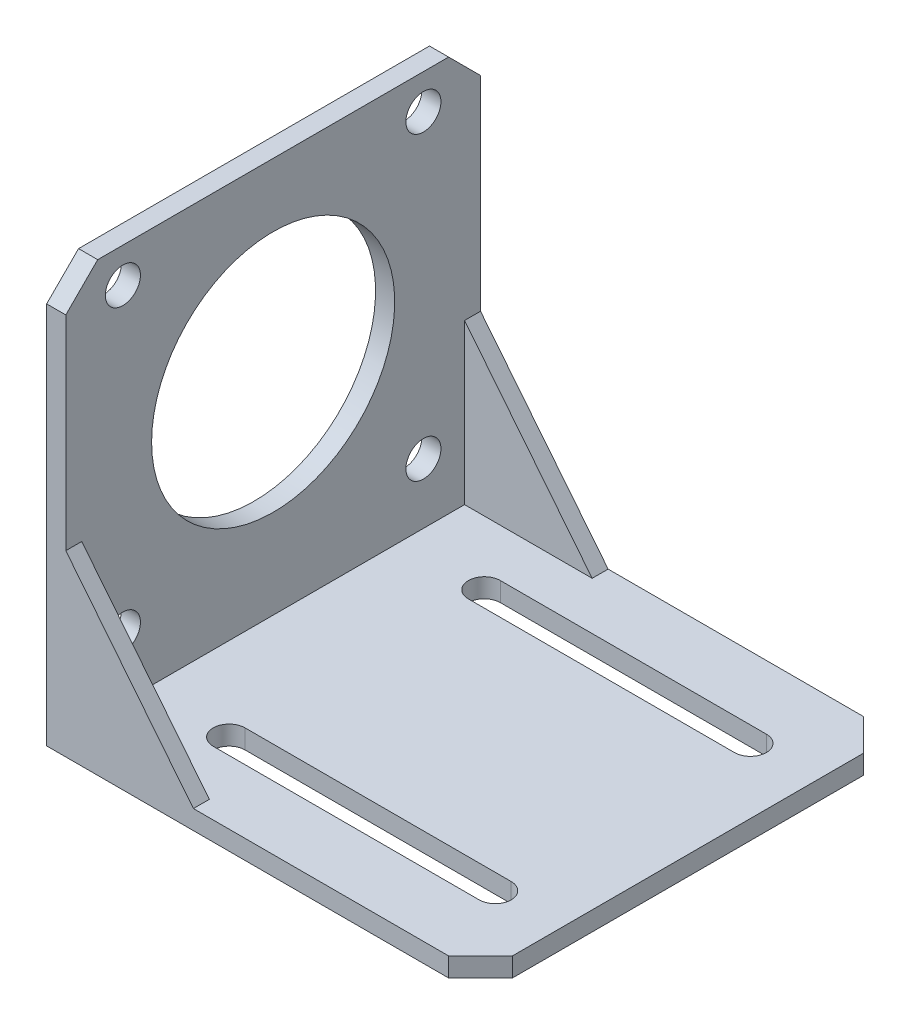
ISO-10303-21;
HEADER;
FILE_DESCRIPTION(('STEP AP214'),'2;1');
FILE_NAME('part.step','',(''),(''),'','','');
FILE_SCHEMA(('AUTOMOTIVE_DESIGN { 1 0 10303 214 1 1 1 1 }'));
ENDSEC;
DATA;
#1=APPLICATION_CONTEXT('core data for automotive mechanical design processes');
#2=APPLICATION_PROTOCOL_DEFINITION('international standard','automotive_design',2000,#1);
#3=PRODUCT_CONTEXT('',#1,'mechanical');
#4=PRODUCT('Part','Part','',(#3));
#5=PRODUCT_RELATED_PRODUCT_CATEGORY('part','',(#4));
#6=PRODUCT_DEFINITION_FORMATION('','',#4);
#7=PRODUCT_DEFINITION_CONTEXT('part definition',#1,'design');
#8=PRODUCT_DEFINITION('design','',#6,#7);
#9=PRODUCT_DEFINITION_SHAPE('','',#8);
#10=(LENGTH_UNIT() NAMED_UNIT(*) SI_UNIT(.MILLI.,.METRE.));
#11=(NAMED_UNIT(*) PLANE_ANGLE_UNIT() SI_UNIT($,.RADIAN.));
#12=(NAMED_UNIT(*) SI_UNIT($,.STERADIAN.) SOLID_ANGLE_UNIT());
#13=UNCERTAINTY_MEASURE_WITH_UNIT(LENGTH_MEASURE(1.E-05),#10,'distance_accuracy_value','');
#14=(GEOMETRIC_REPRESENTATION_CONTEXT(3) GLOBAL_UNCERTAINTY_ASSIGNED_CONTEXT((#13)) GLOBAL_UNIT_ASSIGNED_CONTEXT((#10,
#11,#12)) REPRESENTATION_CONTEXT('',''));
#15=CARTESIAN_POINT('',(0.,0.,0.));
#16=DIRECTION('',(0.,0.,1.));
#17=DIRECTION('',(1.,0.,0.));
#18=AXIS2_PLACEMENT_3D('',#15,#16,#17);
#19=CARTESIAN_POINT('',(34.,3.,-32.5));
#20=DIRECTION('',(-1.,0.,0.));
#21=DIRECTION('',(0.,0.,1.));
#22=AXIS2_PLACEMENT_3D('',#19,#20,#21);
#23=PLANE('',#22);
#24=DIRECTION('',(0.,0.,-1.));
#25=VECTOR('',#24,1.);
#26=CARTESIAN_POINT('',(34.,3.,-32.5));
#27=LINE('',#26,#25);
#28=CARTESIAN_POINT('',(34.,3.,27.5));
#29=VERTEX_POINT('',#28);
#30=CARTESIAN_POINT('',(34.,3.,-27.5));
#31=VERTEX_POINT('',#30);
#32=EDGE_CURVE('E217',#29,#31,#27,.T.);
#33=ORIENTED_EDGE('',*,*,#32,.F.);
#34=DIRECTION('',(0.,-1.,0.));
#35=VECTOR('',#34,1.);
#36=CARTESIAN_POINT('',(34.,3.,27.5));
#37=LINE('',#36,#35);
#38=CARTESIAN_POINT('',(34.,0.,27.5));
#39=VERTEX_POINT('',#38);
#40=EDGE_CURVE('E241',#29,#39,#37,.T.);
#41=ORIENTED_EDGE('',*,*,#40,.T.);
#42=DIRECTION('',(0.,0.,-1.));
#43=VECTOR('',#42,1.);
#44=CARTESIAN_POINT('',(34.,0.,-32.5));
#45=LINE('',#44,#43);
#46=CARTESIAN_POINT('',(34.,0.,-27.5));
#47=VERTEX_POINT('',#46);
#48=EDGE_CURVE('E297',#39,#47,#45,.T.);
#49=ORIENTED_EDGE('',*,*,#48,.T.);
#50=DIRECTION('',(0.,1.,0.));
#51=VECTOR('',#50,1.);
#52=CARTESIAN_POINT('',(34.,3.,-27.5));
#53=LINE('',#52,#51);
#54=EDGE_CURVE('E244',#47,#31,#53,.T.);
#55=ORIENTED_EDGE('',*,*,#54,.T.);
#56=EDGE_LOOP('',(#33,#41,#49,#55));
#57=FACE_BOUND('',#56,.T.);
#58=ADVANCED_FACE('F33',(#57),#23,.F.);
#59=CARTESIAN_POINT('',(-34.,3.,-32.5));
#60=DIRECTION('',(0.,0.,1.));
#61=DIRECTION('',(1.,0.,0.));
#62=AXIS2_PLACEMENT_3D('',#59,#60,#61);
#63=PLANE('',#62);
#64=DIRECTION('',(-1.,0.,0.));
#65=VECTOR('',#64,1.);
#66=CARTESIAN_POINT('',(-34.,3.,-32.5));
#67=LINE('',#66,#65);
#68=CARTESIAN_POINT('',(29.,3.,-32.5));
#69=VERTEX_POINT('',#68);
#70=CARTESIAN_POINT('',(-11.,3.,-32.5));
#71=VERTEX_POINT('',#70);
#72=EDGE_CURVE('E220',#69,#71,#67,.T.);
#73=ORIENTED_EDGE('',*,*,#72,.F.);
#74=DIRECTION('',(0.,-1.,0.));
#75=VECTOR('',#74,1.);
#76=CARTESIAN_POINT('',(29.,3.,-32.5));
#77=LINE('',#76,#75);
#78=CARTESIAN_POINT('',(29.,0.,-32.5));
#79=VERTEX_POINT('',#78);
#80=EDGE_CURVE('E11',#69,#79,#77,.T.);
#81=ORIENTED_EDGE('',*,*,#80,.T.);
#82=DIRECTION('',(-1.,0.,0.));
#83=VECTOR('',#82,1.);
#84=CARTESIAN_POINT('',(-34.,0.,-32.5));
#85=LINE('',#84,#83);
#86=CARTESIAN_POINT('',(-34.,0.,-32.5));
#87=VERTEX_POINT('',#86);
#88=EDGE_CURVE('E266',#79,#87,#85,.T.);
#89=ORIENTED_EDGE('',*,*,#88,.T.);
#90=DIRECTION('',(0.,-1.,0.));
#91=VECTOR('',#90,1.);
#92=CARTESIAN_POINT('',(-34.,3.,-32.5));
#93=LINE('',#92,#91);
#94=CARTESIAN_POINT('',(-34.,60.,-32.5));
#95=VERTEX_POINT('',#94);
#96=EDGE_CURVE('E271',#95,#87,#93,.T.);
#97=ORIENTED_EDGE('',*,*,#96,.F.);
#98=DIRECTION('',(1.,0.,0.));
#99=VECTOR('',#98,1.);
#100=CARTESIAN_POINT('',(-31.,60.,-32.5));
#101=LINE('',#100,#99);
#102=CARTESIAN_POINT('',(-31.,60.,-32.5));
#103=VERTEX_POINT('',#102);
#104=EDGE_CURVE('E287',#95,#103,#101,.T.);
#105=ORIENTED_EDGE('',*,*,#104,.T.);
#106=DIRECTION('',(0.,-1.,0.));
#107=VECTOR('',#106,1.);
#108=CARTESIAN_POINT('',(-31.,65.,-32.5));
#109=LINE('',#108,#107);
#110=CARTESIAN_POINT('',(-31.,28.,-32.5));
#111=VERTEX_POINT('',#110);
#112=EDGE_CURVE('E280',#103,#111,#109,.T.);
#113=ORIENTED_EDGE('',*,*,#112,.T.);
#114=DIRECTION('',(0.624695047554424,-0.78086880944303,0.));
#115=VECTOR('',#114,1.);
#116=CARTESIAN_POINT('',(-31.,28.,-32.5));
#117=LINE('',#116,#115);
#118=EDGE_CURVE('E200',#111,#71,#117,.T.);
#119=ORIENTED_EDGE('',*,*,#118,.T.);
#120=EDGE_LOOP('',(#73,#81,#89,#97,#105,#113,#119));
#121=FACE_BOUND('',#120,.T.);
#122=ADVANCED_FACE('F437',(#121),#63,.F.);
#123=CARTESIAN_POINT('',(-34.,3.,-32.5));
#124=DIRECTION('',(1.,0.,0.));
#125=DIRECTION('',(0.,0.,-1.));
#126=AXIS2_PLACEMENT_3D('',#123,#124,#125);
#127=PLANE('',#126);
#128=CARTESIAN_POINT('',(-34.,59.55,23.55));
#129=DIRECTION('',(-1.,0.,0.));
#130=DIRECTION('',(0.,0.,1.));
#131=AXIS2_PLACEMENT_3D('',#128,#129,#130);
#132=CIRCLE('',#131,2.75);
#133=CARTESIAN_POINT('',(-34.,59.55,26.3));
#134=VERTEX_POINT('',#133);
#135=EDGE_CURVE('E327',#134,#134,#132,.T.);
#136=ORIENTED_EDGE('',*,*,#135,.F.);
#137=EDGE_LOOP('',(#136));
#138=FACE_BOUND('',#137,.T.);
#139=CARTESIAN_POINT('',(-34.,59.55,-23.55));
#140=DIRECTION('',(-1.,0.,0.));
#141=DIRECTION('',(0.,0.,1.));
#142=AXIS2_PLACEMENT_3D('',#139,#140,#141);
#143=CIRCLE('',#142,2.75);
#144=CARTESIAN_POINT('',(-34.,59.55,-20.8));
#145=VERTEX_POINT('',#144);
#146=EDGE_CURVE('E332',#145,#145,#143,.T.);
#147=ORIENTED_EDGE('',*,*,#146,.F.);
#148=EDGE_LOOP('',(#147));
#149=FACE_BOUND('',#148,.T.);
#150=CARTESIAN_POINT('',(-34.,12.45,-23.55));
#151=DIRECTION('',(-1.,0.,0.));
#152=DIRECTION('',(0.,0.,1.));
#153=AXIS2_PLACEMENT_3D('',#150,#151,#152);
#154=CIRCLE('',#153,2.75);
#155=CARTESIAN_POINT('',(-34.,12.45,-20.8));
#156=VERTEX_POINT('',#155);
#157=EDGE_CURVE('E336',#156,#156,#154,.T.);
#158=ORIENTED_EDGE('',*,*,#157,.F.);
#159=EDGE_LOOP('',(#158));
#160=FACE_BOUND('',#159,.T.);
#161=CARTESIAN_POINT('',(-34.,12.45,23.55));
#162=DIRECTION('',(-1.,0.,0.));
#163=DIRECTION('',(0.,0.,1.));
#164=AXIS2_PLACEMENT_3D('',#161,#162,#163);
#165=CIRCLE('',#164,2.75);
#166=CARTESIAN_POINT('',(-34.,12.45,26.3));
#167=VERTEX_POINT('',#166);
#168=EDGE_CURVE('E340',#167,#167,#165,.T.);
#169=ORIENTED_EDGE('',*,*,#168,.F.);
#170=EDGE_LOOP('',(#169));
#171=FACE_BOUND('',#170,.T.);
#172=CARTESIAN_POINT('',(-34.,36.,0.));
#173=DIRECTION('',(-1.,0.,0.));
#174=DIRECTION('',(0.,0.,1.));
#175=AXIS2_PLACEMENT_3D('',#172,#173,#174);
#176=CIRCLE('',#175,19.05);
#177=CARTESIAN_POINT('',(-34.,36.,19.05));
#178=VERTEX_POINT('',#177);
#179=EDGE_CURVE('E344',#178,#178,#176,.T.);
#180=ORIENTED_EDGE('',*,*,#179,.F.);
#181=EDGE_LOOP('',(#180));
#182=FACE_BOUND('',#181,.T.);
#183=DIRECTION('',(0.,-1.,0.));
#184=VECTOR('',#183,1.);
#185=CARTESIAN_POINT('',(-34.,3.,32.5));
#186=LINE('',#185,#184);
#187=CARTESIAN_POINT('',(-34.,60.,32.5));
#188=VERTEX_POINT('',#187);
#189=CARTESIAN_POINT('',(-34.,0.,32.5));
#190=VERTEX_POINT('',#189);
#191=EDGE_CURVE('E261',#188,#190,#186,.T.);
#192=ORIENTED_EDGE('',*,*,#191,.F.);
#193=DIRECTION('',(0.,0.707106781186549,-0.707106781186546));
#194=VECTOR('',#193,1.);
#195=CARTESIAN_POINT('',(-34.,65.,27.5));
#196=LINE('',#195,#194);
#197=CARTESIAN_POINT('',(-34.,65.,27.5));
#198=VERTEX_POINT('',#197);
#199=EDGE_CURVE('E250',#188,#198,#196,.T.);
#200=ORIENTED_EDGE('',*,*,#199,.T.);
#201=DIRECTION('',(0.,0.,1.));
#202=VECTOR('',#201,1.);
#203=CARTESIAN_POINT('',(-34.,65.,-32.5));
#204=LINE('',#203,#202);
#205=CARTESIAN_POINT('',(-34.,65.,-27.5));
#206=VERTEX_POINT('',#205);
#207=EDGE_CURVE('E205',#206,#198,#204,.T.);
#208=ORIENTED_EDGE('',*,*,#207,.F.);
#209=DIRECTION('',(0.,-0.707106781186549,-0.707106781186546));
#210=VECTOR('',#209,1.);
#211=CARTESIAN_POINT('',(-34.,65.,-27.5));
#212=LINE('',#211,#210);
#213=EDGE_CURVE('E285',#206,#95,#212,.T.);
#214=ORIENTED_EDGE('',*,*,#213,.T.);
#215=ORIENTED_EDGE('',*,*,#96,.T.);
#216=DIRECTION('',(0.,0.,1.));
#217=VECTOR('',#216,1.);
#218=CARTESIAN_POINT('',(-34.,0.,-32.5));
#219=LINE('',#218,#217);
#220=EDGE_CURVE('E264',#87,#190,#219,.T.);
#221=ORIENTED_EDGE('',*,*,#220,.T.);
#222=EDGE_LOOP('',(#192,#200,#208,#214,#215,#221));
#223=FACE_BOUND('',#222,.T.);
#224=ADVANCED_FACE('F303',(#138,#149,#160,#171,#182,#223),#127,.F.);
#225=CARTESIAN_POINT('',(-34.,3.,32.5));
#226=DIRECTION('',(0.,0.,-1.));
#227=DIRECTION('',(-1.,0.,0.));
#228=AXIS2_PLACEMENT_3D('',#225,#226,#227);
#229=PLANE('',#228);
#230=DIRECTION('',(1.,0.,0.));
#231=VECTOR('',#230,1.);
#232=CARTESIAN_POINT('',(-34.,3.,32.5));
#233=LINE('',#232,#231);
#234=CARTESIAN_POINT('',(-11.,3.,32.5));
#235=VERTEX_POINT('',#234);
#236=CARTESIAN_POINT('',(29.,3.,32.5));
#237=VERTEX_POINT('',#236);
#238=EDGE_CURVE('E37',#235,#237,#233,.T.);
#239=ORIENTED_EDGE('',*,*,#238,.F.);
#240=DIRECTION('',(-0.624695047554424,0.78086880944303,0.));
#241=VECTOR('',#240,1.);
#242=CARTESIAN_POINT('',(-31.,28.,32.5));
#243=LINE('',#242,#241);
#244=CARTESIAN_POINT('',(-31.,28.,32.5));
#245=VERTEX_POINT('',#244);
#246=EDGE_CURVE('E315',#235,#245,#243,.T.);
#247=ORIENTED_EDGE('',*,*,#246,.T.);
#248=DIRECTION('',(0.,-1.,0.));
#249=VECTOR('',#248,1.);
#250=CARTESIAN_POINT('',(-31.,65.,32.5));
#251=LINE('',#250,#249);
#252=CARTESIAN_POINT('',(-31.,60.,32.5));
#253=VERTEX_POINT('',#252);
#254=EDGE_CURVE('E284',#253,#245,#251,.T.);
#255=ORIENTED_EDGE('',*,*,#254,.F.);
#256=DIRECTION('',(-1.,0.,0.));
#257=VECTOR('',#256,1.);
#258=CARTESIAN_POINT('',(-34.,60.,32.5));
#259=LINE('',#258,#257);
#260=EDGE_CURVE('E299',#253,#188,#259,.T.);
#261=ORIENTED_EDGE('',*,*,#260,.T.);
#262=ORIENTED_EDGE('',*,*,#191,.T.);
#263=DIRECTION('',(1.,0.,0.));
#264=VECTOR('',#263,1.);
#265=CARTESIAN_POINT('',(-34.,0.,32.5));
#266=LINE('',#265,#264);
#267=CARTESIAN_POINT('',(29.,0.,32.5));
#268=VERTEX_POINT('',#267);
#269=EDGE_CURVE('E221',#190,#268,#266,.T.);
#270=ORIENTED_EDGE('',*,*,#269,.T.);
#271=DIRECTION('',(0.,1.,0.));
#272=VECTOR('',#271,1.);
#273=CARTESIAN_POINT('',(29.,3.,32.5));
#274=LINE('',#273,#272);
#275=EDGE_CURVE('E228',#268,#237,#274,.T.);
#276=ORIENTED_EDGE('',*,*,#275,.T.);
#277=EDGE_LOOP('',(#239,#247,#255,#261,#262,#270,#276));
#278=FACE_BOUND('',#277,.T.);
#279=ADVANCED_FACE('F257',(#278),#229,.F.);
#280=CARTESIAN_POINT('',(0.,3.,0.));
#281=DIRECTION('',(0.,1.,0.));
#282=DIRECTION('',(0.,0.,1.));
#283=AXIS2_PLACEMENT_3D('',#280,#281,#282);
#284=PLANE('',#283);
#285=DIRECTION('',(0.,0.,-1.));
#286=VECTOR('',#285,1.);
#287=CARTESIAN_POINT('',(-11.,3.,-30.));
#288=LINE('',#287,#286);
#289=CARTESIAN_POINT('',(-11.,3.,-30.));
#290=VERTEX_POINT('',#289);
#291=EDGE_CURVE('E199',#290,#71,#288,.T.);
#292=ORIENTED_EDGE('',*,*,#291,.F.);
#293=DIRECTION('',(-1.,0.,0.));
#294=VECTOR('',#293,1.);
#295=CARTESIAN_POINT('',(-11.,3.,-30.));
#296=LINE('',#295,#294);
#297=CARTESIAN_POINT('',(-31.,3.,-30.));
#298=VERTEX_POINT('',#297);
#299=EDGE_CURVE('E187',#290,#298,#296,.T.);
#300=ORIENTED_EDGE('',*,*,#299,.T.);
#301=DIRECTION('',(0.,0.,-1.));
#302=VECTOR('',#301,1.);
#303=CARTESIAN_POINT('',(-31.,3.,-32.5));
#304=LINE('',#303,#302);
#305=CARTESIAN_POINT('',(-31.,3.,30.));
#306=VERTEX_POINT('',#305);
#307=EDGE_CURVE('E197',#306,#298,#304,.T.);
#308=ORIENTED_EDGE('',*,*,#307,.F.);
#309=DIRECTION('',(1.,0.,0.));
#310=VECTOR('',#309,1.);
#311=CARTESIAN_POINT('',(-11.,3.,30.));
#312=LINE('',#311,#310);
#313=CARTESIAN_POINT('',(-11.,3.,30.));
#314=VERTEX_POINT('',#313);
#315=EDGE_CURVE('E51',#306,#314,#312,.T.);
#316=ORIENTED_EDGE('',*,*,#315,.T.);
#317=DIRECTION('',(0.,0.,1.));
#318=VECTOR('',#317,1.);
#319=CARTESIAN_POINT('',(-11.,3.,30.));
#320=LINE('',#319,#318);
#321=EDGE_CURVE('E55',#314,#235,#320,.T.);
#322=ORIENTED_EDGE('',*,*,#321,.T.);
#323=ORIENTED_EDGE('',*,*,#238,.T.);
#324=DIRECTION('',(-0.707106781186549,0.,0.707106781186547));
#325=VECTOR('',#324,1.);
#326=CARTESIAN_POINT('',(30.75,3.,30.7500000000001));
#327=LINE('',#326,#325);
#328=EDGE_CURVE('E43',#237,#29,#327,.F.);
#329=ORIENTED_EDGE('',*,*,#328,.T.);
#330=ORIENTED_EDGE('',*,*,#32,.T.);
#331=DIRECTION('',(0.707106781186547,0.,0.707106781186549));
#332=VECTOR('',#331,1.);
#333=CARTESIAN_POINT('',(30.75,3.,-30.7499999999999));
#334=LINE('',#333,#332);
#335=EDGE_CURVE('E230',#31,#69,#334,.F.);
#336=ORIENTED_EDGE('',*,*,#335,.T.);
#337=ORIENTED_EDGE('',*,*,#72,.T.);
#338=EDGE_LOOP('',(#292,#300,#308,#316,#322,#323,#329,#330,#336,#337));
#339=FACE_BOUND('',#338,.T.);
#340=CARTESIAN_POINT('',(-17.9,3.,20.));
#341=DIRECTION('',(0.,1.,0.));
#342=DIRECTION('',(0.,0.,1.));
#343=AXIS2_PLACEMENT_3D('',#340,#341,#342);
#344=CIRCLE('',#343,2.5);
#345=CARTESIAN_POINT('',(-17.9,3.,17.5));
#346=VERTEX_POINT('',#345);
#347=CARTESIAN_POINT('',(-17.9,3.,22.5));
#348=VERTEX_POINT('',#347);
#349=EDGE_CURVE('E362',#346,#348,#344,.T.);
#350=ORIENTED_EDGE('',*,*,#349,.F.);
#351=DIRECTION('',(-1.,0.,0.));
#352=VECTOR('',#351,1.);
#353=CARTESIAN_POINT('',(-17.9,3.,17.5));
#354=LINE('',#353,#352);
#355=CARTESIAN_POINT('',(23.8,3.,17.5));
#356=VERTEX_POINT('',#355);
#357=EDGE_CURVE('E352',#356,#346,#354,.T.);
#358=ORIENTED_EDGE('',*,*,#357,.F.);
#359=CARTESIAN_POINT('',(23.8,3.,20.));
#360=DIRECTION('',(0.,1.,0.));
#361=DIRECTION('',(0.,0.,-1.));
#362=AXIS2_PLACEMENT_3D('',#359,#360,#361);
#363=CIRCLE('',#362,2.5);
#364=CARTESIAN_POINT('',(23.8,3.,22.5));
#365=VERTEX_POINT('',#364);
#366=EDGE_CURVE('E367',#365,#356,#363,.T.);
#367=ORIENTED_EDGE('',*,*,#366,.F.);
#368=DIRECTION('',(1.,0.,0.));
#369=VECTOR('',#368,1.);
#370=CARTESIAN_POINT('',(-17.9,3.,22.5));
#371=LINE('',#370,#369);
#372=EDGE_CURVE('E364',#348,#365,#371,.T.);
#373=ORIENTED_EDGE('',*,*,#372,.F.);
#374=EDGE_LOOP('',(#350,#358,#367,#373));
#375=FACE_BOUND('',#374,.T.);
#376=CARTESIAN_POINT('',(-17.9,3.,-20.));
#377=DIRECTION('',(0.,1.,0.));
#378=DIRECTION('',(0.,0.,1.));
#379=AXIS2_PLACEMENT_3D('',#376,#377,#378);
#380=CIRCLE('',#379,2.5);
#381=CARTESIAN_POINT('',(-17.9,3.,-22.5));
#382=VERTEX_POINT('',#381);
#383=CARTESIAN_POINT('',(-17.9,3.,-17.5));
#384=VERTEX_POINT('',#383);
#385=EDGE_CURVE('E374',#382,#384,#380,.T.);
#386=ORIENTED_EDGE('',*,*,#385,.F.);
#387=DIRECTION('',(-1.,0.,0.));
#388=VECTOR('',#387,1.);
#389=CARTESIAN_POINT('',(-17.9,3.,-22.5));
#390=LINE('',#389,#388);
#391=CARTESIAN_POINT('',(23.8,3.,-22.5));
#392=VERTEX_POINT('',#391);
#393=EDGE_CURVE('E385',#392,#382,#390,.T.);
#394=ORIENTED_EDGE('',*,*,#393,.F.);
#395=CARTESIAN_POINT('',(23.8,3.,-20.));
#396=DIRECTION('',(0.,1.,0.));
#397=DIRECTION('',(0.,0.,-1.));
#398=AXIS2_PLACEMENT_3D('',#395,#396,#397);
#399=CIRCLE('',#398,2.5);
#400=CARTESIAN_POINT('',(23.8,3.,-17.5));
#401=VERTEX_POINT('',#400);
#402=EDGE_CURVE('E399',#401,#392,#399,.T.);
#403=ORIENTED_EDGE('',*,*,#402,.F.);
#404=DIRECTION('',(1.,0.,0.));
#405=VECTOR('',#404,1.);
#406=CARTESIAN_POINT('',(-17.9,3.,-17.5));
#407=LINE('',#406,#405);
#408=EDGE_CURVE('E396',#384,#401,#407,.T.);
#409=ORIENTED_EDGE('',*,*,#408,.F.);
#410=EDGE_LOOP('',(#386,#394,#403,#409));
#411=FACE_BOUND('',#410,.T.);
#412=ADVANCED_FACE('F195',(#339,#375,#411),#284,.T.);
#413=CARTESIAN_POINT('',(0.,0.,0.));
#414=DIRECTION('',(0.,1.,0.));
#415=DIRECTION('',(0.,0.,1.));
#416=AXIS2_PLACEMENT_3D('',#413,#414,#415);
#417=PLANE('',#416);
#418=DIRECTION('',(-1.,0.,0.));
#419=VECTOR('',#418,1.);
#420=CARTESIAN_POINT('',(-17.9,0.,17.5));
#421=LINE('',#420,#419);
#422=CARTESIAN_POINT('',(23.8,0.,17.5));
#423=VERTEX_POINT('',#422);
#424=CARTESIAN_POINT('',(-17.9,0.,17.5));
#425=VERTEX_POINT('',#424);
#426=EDGE_CURVE('E358',#423,#425,#421,.T.);
#427=ORIENTED_EDGE('',*,*,#426,.T.);
#428=CARTESIAN_POINT('',(-17.9,0.,20.));
#429=DIRECTION('',(0.,1.,0.));
#430=DIRECTION('',(0.,0.,1.));
#431=AXIS2_PLACEMENT_3D('',#428,#429,#430);
#432=CIRCLE('',#431,2.5);
#433=CARTESIAN_POINT('',(-17.9,0.,22.5));
#434=VERTEX_POINT('',#433);
#435=EDGE_CURVE('E348',#425,#434,#432,.T.);
#436=ORIENTED_EDGE('',*,*,#435,.T.);
#437=DIRECTION('',(1.,0.,0.));
#438=VECTOR('',#437,1.);
#439=CARTESIAN_POINT('',(-17.9,0.,22.5));
#440=LINE('',#439,#438);
#441=CARTESIAN_POINT('',(23.8,0.,22.5));
#442=VERTEX_POINT('',#441);
#443=EDGE_CURVE('E351',#434,#442,#440,.T.);
#444=ORIENTED_EDGE('',*,*,#443,.T.);
#445=CARTESIAN_POINT('',(23.8,0.,20.));
#446=DIRECTION('',(0.,1.,0.));
#447=DIRECTION('',(0.,0.,-1.));
#448=AXIS2_PLACEMENT_3D('',#445,#446,#447);
#449=CIRCLE('',#448,2.5);
#450=EDGE_CURVE('E355',#442,#423,#449,.T.);
#451=ORIENTED_EDGE('',*,*,#450,.T.);
#452=EDGE_LOOP('',(#427,#436,#444,#451));
#453=FACE_BOUND('',#452,.T.);
#454=DIRECTION('',(-1.,0.,0.));
#455=VECTOR('',#454,1.);
#456=CARTESIAN_POINT('',(-17.9,0.,-22.5));
#457=LINE('',#456,#455);
#458=CARTESIAN_POINT('',(23.8,0.,-22.5));
#459=VERTEX_POINT('',#458);
#460=CARTESIAN_POINT('',(-17.9,0.,-22.5));
#461=VERTEX_POINT('',#460);
#462=EDGE_CURVE('E391',#459,#461,#457,.T.);
#463=ORIENTED_EDGE('',*,*,#462,.T.);
#464=CARTESIAN_POINT('',(-17.9,0.,-20.));
#465=DIRECTION('',(0.,1.,0.));
#466=DIRECTION('',(0.,0.,1.));
#467=AXIS2_PLACEMENT_3D('',#464,#465,#466);
#468=CIRCLE('',#467,2.5);
#469=CARTESIAN_POINT('',(-17.9,0.,-17.5));
#470=VERTEX_POINT('',#469);
#471=EDGE_CURVE('E381',#461,#470,#468,.T.);
#472=ORIENTED_EDGE('',*,*,#471,.T.);
#473=DIRECTION('',(1.,0.,0.));
#474=VECTOR('',#473,1.);
#475=CARTESIAN_POINT('',(-17.9,0.,-17.5));
#476=LINE('',#475,#474);
#477=CARTESIAN_POINT('',(23.8,0.,-17.5));
#478=VERTEX_POINT('',#477);
#479=EDGE_CURVE('E384',#470,#478,#476,.T.);
#480=ORIENTED_EDGE('',*,*,#479,.T.);
#481=CARTESIAN_POINT('',(23.8,0.,-20.));
#482=DIRECTION('',(0.,1.,0.));
#483=DIRECTION('',(0.,0.,-1.));
#484=AXIS2_PLACEMENT_3D('',#481,#482,#483);
#485=CIRCLE('',#484,2.5);
#486=EDGE_CURVE('E388',#478,#459,#485,.T.);
#487=ORIENTED_EDGE('',*,*,#486,.T.);
#488=EDGE_LOOP('',(#463,#472,#480,#487));
#489=FACE_BOUND('',#488,.T.);
#490=ORIENTED_EDGE('',*,*,#48,.F.);
#491=DIRECTION('',(0.707106781186549,0.,-0.707106781186547));
#492=VECTOR('',#491,1.);
#493=CARTESIAN_POINT('',(34.,0.,27.5));
#494=LINE('',#493,#492);
#495=EDGE_CURVE('E246',#39,#268,#494,.F.);
#496=ORIENTED_EDGE('',*,*,#495,.T.);
#497=ORIENTED_EDGE('',*,*,#269,.F.);
#498=ORIENTED_EDGE('',*,*,#220,.F.);
#499=ORIENTED_EDGE('',*,*,#88,.F.);
#500=DIRECTION('',(-0.707106781186547,0.,-0.707106781186549));
#501=VECTOR('',#500,1.);
#502=CARTESIAN_POINT('',(29.,0.,-32.5));
#503=LINE('',#502,#501);
#504=EDGE_CURVE('E247',#79,#47,#503,.F.);
#505=ORIENTED_EDGE('',*,*,#504,.T.);
#506=EDGE_LOOP('',(#490,#496,#497,#498,#499,#505));
#507=FACE_BOUND('',#506,.T.);
#508=ADVANCED_FACE('F423',(#453,#489,#507),#417,.F.);
#509=CARTESIAN_POINT('',(-31.,65.,-32.5));
#510=DIRECTION('',(-1.,0.,0.));
#511=DIRECTION('',(0.,0.,1.));
#512=AXIS2_PLACEMENT_3D('',#509,#510,#511);
#513=PLANE('',#512);
#514=CARTESIAN_POINT('',(-31.,59.55,23.55));
#515=DIRECTION('',(-1.,0.,0.));
#516=DIRECTION('',(0.,0.,1.));
#517=AXIS2_PLACEMENT_3D('',#514,#515,#516);
#518=CIRCLE('',#517,2.74999999999999);
#519=CARTESIAN_POINT('',(-31.,59.55,26.3));
#520=VERTEX_POINT('',#519);
#521=EDGE_CURVE('E331',#520,#520,#518,.T.);
#522=ORIENTED_EDGE('',*,*,#521,.T.);
#523=EDGE_LOOP('',(#522));
#524=FACE_BOUND('',#523,.T.);
#525=CARTESIAN_POINT('',(-31.,59.55,-23.55));
#526=DIRECTION('',(-1.,0.,0.));
#527=DIRECTION('',(0.,0.,1.));
#528=AXIS2_PLACEMENT_3D('',#525,#526,#527);
#529=CIRCLE('',#528,2.74999999999999);
#530=CARTESIAN_POINT('',(-31.,59.55,-20.8));
#531=VERTEX_POINT('',#530);
#532=EDGE_CURVE('E335',#531,#531,#529,.T.);
#533=ORIENTED_EDGE('',*,*,#532,.T.);
#534=EDGE_LOOP('',(#533));
#535=FACE_BOUND('',#534,.T.);
#536=CARTESIAN_POINT('',(-31.,12.45,-23.55));
#537=DIRECTION('',(-1.,0.,0.));
#538=DIRECTION('',(0.,0.,1.));
#539=AXIS2_PLACEMENT_3D('',#536,#537,#538);
#540=CIRCLE('',#539,2.74999999999999);
#541=CARTESIAN_POINT('',(-31.,12.45,-20.8));
#542=VERTEX_POINT('',#541);
#543=EDGE_CURVE('E339',#542,#542,#540,.T.);
#544=ORIENTED_EDGE('',*,*,#543,.T.);
#545=EDGE_LOOP('',(#544));
#546=FACE_BOUND('',#545,.T.);
#547=CARTESIAN_POINT('',(-31.,12.45,23.55));
#548=DIRECTION('',(-1.,0.,0.));
#549=DIRECTION('',(0.,0.,1.));
#550=AXIS2_PLACEMENT_3D('',#547,#548,#549);
#551=CIRCLE('',#550,2.74999999999999);
#552=CARTESIAN_POINT('',(-31.,12.45,26.3));
#553=VERTEX_POINT('',#552);
#554=EDGE_CURVE('E343',#553,#553,#551,.T.);
#555=ORIENTED_EDGE('',*,*,#554,.T.);
#556=EDGE_LOOP('',(#555));
#557=FACE_BOUND('',#556,.T.);
#558=CARTESIAN_POINT('',(-31.,36.,0.));
#559=DIRECTION('',(-1.,0.,0.));
#560=DIRECTION('',(0.,0.,1.));
#561=AXIS2_PLACEMENT_3D('',#558,#559,#560);
#562=CIRCLE('',#561,19.05);
#563=CARTESIAN_POINT('',(-31.,36.,19.05));
#564=VERTEX_POINT('',#563);
#565=EDGE_CURVE('E347',#564,#564,#562,.T.);
#566=ORIENTED_EDGE('',*,*,#565,.T.);
#567=EDGE_LOOP('',(#566));
#568=FACE_BOUND('',#567,.T.);
#569=DIRECTION('',(0.,1.,0.));
#570=VECTOR('',#569,1.);
#571=CARTESIAN_POINT('',(-31.,3.,-30.));
#572=LINE('',#571,#570);
#573=CARTESIAN_POINT('',(-31.,28.,-30.));
#574=VERTEX_POINT('',#573);
#575=EDGE_CURVE('E184',#298,#574,#572,.T.);
#576=ORIENTED_EDGE('',*,*,#575,.T.);
#577=DIRECTION('',(0.,0.,-1.));
#578=VECTOR('',#577,1.);
#579=CARTESIAN_POINT('',(-31.,28.,-30.));
#580=LINE('',#579,#578);
#581=EDGE_CURVE('E320',#574,#111,#580,.T.);
#582=ORIENTED_EDGE('',*,*,#581,.T.);
#583=ORIENTED_EDGE('',*,*,#112,.F.);
#584=DIRECTION('',(0.,0.707106781186549,0.707106781186546));
#585=VECTOR('',#584,1.);
#586=CARTESIAN_POINT('',(-31.,65.,-27.5));
#587=LINE('',#586,#585);
#588=CARTESIAN_POINT('',(-31.,65.,-27.5));
#589=VERTEX_POINT('',#588);
#590=EDGE_CURVE('E289',#103,#589,#587,.T.);
#591=ORIENTED_EDGE('',*,*,#590,.T.);
#592=DIRECTION('',(0.,0.,-1.));
#593=VECTOR('',#592,1.);
#594=CARTESIAN_POINT('',(-31.,65.,-32.5));
#595=LINE('',#594,#593);
#596=CARTESIAN_POINT('',(-31.,65.,27.5));
#597=VERTEX_POINT('',#596);
#598=EDGE_CURVE('E208',#597,#589,#595,.T.);
#599=ORIENTED_EDGE('',*,*,#598,.F.);
#600=DIRECTION('',(0.,-0.707106781186549,0.707106781186546));
#601=VECTOR('',#600,1.);
#602=CARTESIAN_POINT('',(-31.,65.,27.5));
#603=LINE('',#602,#601);
#604=EDGE_CURVE('E295',#597,#253,#603,.T.);
#605=ORIENTED_EDGE('',*,*,#604,.T.);
#606=ORIENTED_EDGE('',*,*,#254,.T.);
#607=DIRECTION('',(0.,0.,1.));
#608=VECTOR('',#607,1.);
#609=CARTESIAN_POINT('',(-31.,28.,30.));
#610=LINE('',#609,#608);
#611=CARTESIAN_POINT('',(-31.,28.,30.));
#612=VERTEX_POINT('',#611);
#613=EDGE_CURVE('E325',#612,#245,#610,.T.);
#614=ORIENTED_EDGE('',*,*,#613,.F.);
#615=DIRECTION('',(0.,-1.,0.));
#616=VECTOR('',#615,1.);
#617=CARTESIAN_POINT('',(-31.,3.,30.));
#618=LINE('',#617,#616);
#619=EDGE_CURVE('E204',#612,#306,#618,.T.);
#620=ORIENTED_EDGE('',*,*,#619,.T.);
#621=ORIENTED_EDGE('',*,*,#307,.T.);
#622=EDGE_LOOP('',(#576,#582,#583,#591,#599,#605,#606,#614,#620,#621));
#623=FACE_BOUND('',#622,.T.);
#624=ADVANCED_FACE('F202',(#524,#535,#546,#557,#568,#623),#513,.F.);
#625=CARTESIAN_POINT('',(0.,65.,0.));
#626=DIRECTION('',(0.,1.,0.));
#627=DIRECTION('',(0.,0.,1.));
#628=AXIS2_PLACEMENT_3D('',#625,#626,#627);
#629=PLANE('',#628);
#630=ORIENTED_EDGE('',*,*,#207,.T.);
#631=DIRECTION('',(1.,0.,0.));
#632=VECTOR('',#631,1.);
#633=CARTESIAN_POINT('',(-31.,65.,27.5));
#634=LINE('',#633,#632);
#635=EDGE_CURVE('E292',#198,#597,#634,.T.);
#636=ORIENTED_EDGE('',*,*,#635,.T.);
#637=ORIENTED_EDGE('',*,*,#598,.T.);
#638=DIRECTION('',(-1.,0.,0.));
#639=VECTOR('',#638,1.);
#640=CARTESIAN_POINT('',(-34.,65.,-27.5));
#641=LINE('',#640,#639);
#642=EDGE_CURVE('E274',#589,#206,#641,.T.);
#643=ORIENTED_EDGE('',*,*,#642,.T.);
#644=EDGE_LOOP('',(#630,#636,#637,#643));
#645=FACE_BOUND('',#644,.T.);
#646=ADVANCED_FACE('F309',(#645),#629,.T.);
#647=CARTESIAN_POINT('',(-17.9,0.,-20.));
#648=DIRECTION('',(0.,1.,0.));
#649=DIRECTION('',(0.,0.,1.));
#650=AXIS2_PLACEMENT_3D('',#647,#648,#649);
#651=CYLINDRICAL_SURFACE('',#650,2.5);
#652=ORIENTED_EDGE('',*,*,#385,.T.);
#653=DIRECTION('',(0.,1.,0.));
#654=VECTOR('',#653,1.);
#655=CARTESIAN_POINT('',(-17.9,0.,-17.5));
#656=LINE('',#655,#654);
#657=EDGE_CURVE('E394',#470,#384,#656,.T.);
#658=ORIENTED_EDGE('',*,*,#657,.F.);
#659=ORIENTED_EDGE('',*,*,#471,.F.);
#660=DIRECTION('',(0.,1.,0.));
#661=VECTOR('',#660,1.);
#662=CARTESIAN_POINT('',(-17.9,0.,-22.5));
#663=LINE('',#662,#661);
#664=EDGE_CURVE('E206',#461,#382,#663,.T.);
#665=ORIENTED_EDGE('',*,*,#664,.T.);
#666=EDGE_LOOP('',(#652,#658,#659,#665));
#667=FACE_BOUND('',#666,.T.);
#668=ADVANCED_FACE('F424',(#667),#651,.F.);
#669=CARTESIAN_POINT('',(-17.9,0.,-22.5));
#670=DIRECTION('',(0.,0.,-1.));
#671=DIRECTION('',(-1.,0.,0.));
#672=AXIS2_PLACEMENT_3D('',#669,#670,#671);
#673=PLANE('',#672);
#674=ORIENTED_EDGE('',*,*,#393,.T.);
#675=ORIENTED_EDGE('',*,*,#664,.F.);
#676=ORIENTED_EDGE('',*,*,#462,.F.);
#677=DIRECTION('',(0.,1.,0.));
#678=VECTOR('',#677,1.);
#679=CARTESIAN_POINT('',(23.8,0.,-22.5));
#680=LINE('',#679,#678);
#681=EDGE_CURVE('E210',#459,#392,#680,.T.);
#682=ORIENTED_EDGE('',*,*,#681,.T.);
#683=EDGE_LOOP('',(#674,#675,#676,#682));
#684=FACE_BOUND('',#683,.T.);
#685=ADVANCED_FACE('F426',(#684),#673,.F.);
#686=CARTESIAN_POINT('',(23.8,0.,-20.));
#687=DIRECTION('',(0.,1.,0.));
#688=DIRECTION('',(0.,0.,1.));
#689=AXIS2_PLACEMENT_3D('',#686,#687,#688);
#690=CYLINDRICAL_SURFACE('',#689,2.5);
#691=ORIENTED_EDGE('',*,*,#402,.T.);
#692=ORIENTED_EDGE('',*,*,#681,.F.);
#693=ORIENTED_EDGE('',*,*,#486,.F.);
#694=DIRECTION('',(0.,1.,0.));
#695=VECTOR('',#694,1.);
#696=CARTESIAN_POINT('',(23.8,0.,-17.5));
#697=LINE('',#696,#695);
#698=EDGE_CURVE('E405',#478,#401,#697,.T.);
#699=ORIENTED_EDGE('',*,*,#698,.T.);
#700=EDGE_LOOP('',(#691,#692,#693,#699));
#701=FACE_BOUND('',#700,.T.);
#702=ADVANCED_FACE('F420',(#701),#690,.F.);
#703=CARTESIAN_POINT('',(-17.9,0.,-17.5));
#704=DIRECTION('',(0.,0.,1.));
#705=DIRECTION('',(1.,0.,0.));
#706=AXIS2_PLACEMENT_3D('',#703,#704,#705);
#707=PLANE('',#706);
#708=ORIENTED_EDGE('',*,*,#408,.T.);
#709=ORIENTED_EDGE('',*,*,#698,.F.);
#710=ORIENTED_EDGE('',*,*,#479,.F.);
#711=ORIENTED_EDGE('',*,*,#657,.T.);
#712=EDGE_LOOP('',(#708,#709,#710,#711));
#713=FACE_BOUND('',#712,.T.);
#714=ADVANCED_FACE('F411',(#713),#707,.F.);
#715=CARTESIAN_POINT('',(-17.9,0.,20.));
#716=DIRECTION('',(0.,1.,0.));
#717=DIRECTION('',(0.,0.,1.));
#718=AXIS2_PLACEMENT_3D('',#715,#716,#717);
#719=CYLINDRICAL_SURFACE('',#718,2.5);
#720=ORIENTED_EDGE('',*,*,#349,.T.);
#721=DIRECTION('',(0.,1.,0.));
#722=VECTOR('',#721,1.);
#723=CARTESIAN_POINT('',(-17.9,0.,22.5));
#724=LINE('',#723,#722);
#725=EDGE_CURVE('E361',#434,#348,#724,.T.);
#726=ORIENTED_EDGE('',*,*,#725,.F.);
#727=ORIENTED_EDGE('',*,*,#435,.F.);
#728=DIRECTION('',(0.,1.,0.));
#729=VECTOR('',#728,1.);
#730=CARTESIAN_POINT('',(-17.9,0.,17.5));
#731=LINE('',#730,#729);
#732=EDGE_CURVE('E372',#425,#346,#731,.T.);
#733=ORIENTED_EDGE('',*,*,#732,.T.);
#734=EDGE_LOOP('',(#720,#726,#727,#733));
#735=FACE_BOUND('',#734,.T.);
#736=ADVANCED_FACE('F510',(#735),#719,.F.);
#737=CARTESIAN_POINT('',(-17.9,0.,17.5));
#738=DIRECTION('',(0.,0.,-1.));
#739=DIRECTION('',(-1.,0.,0.));
#740=AXIS2_PLACEMENT_3D('',#737,#738,#739);
#741=PLANE('',#740);
#742=ORIENTED_EDGE('',*,*,#357,.T.);
#743=ORIENTED_EDGE('',*,*,#732,.F.);
#744=ORIENTED_EDGE('',*,*,#426,.F.);
#745=DIRECTION('',(0.,1.,0.));
#746=VECTOR('',#745,1.);
#747=CARTESIAN_POINT('',(23.8,0.,17.5));
#748=LINE('',#747,#746);
#749=EDGE_CURVE('E375',#423,#356,#748,.T.);
#750=ORIENTED_EDGE('',*,*,#749,.T.);
#751=EDGE_LOOP('',(#742,#743,#744,#750));
#752=FACE_BOUND('',#751,.T.);
#753=ADVANCED_FACE('F506',(#752),#741,.F.);
#754=CARTESIAN_POINT('',(23.8,0.,20.));
#755=DIRECTION('',(0.,1.,0.));
#756=DIRECTION('',(0.,0.,1.));
#757=AXIS2_PLACEMENT_3D('',#754,#755,#756);
#758=CYLINDRICAL_SURFACE('',#757,2.5);
#759=ORIENTED_EDGE('',*,*,#366,.T.);
#760=ORIENTED_EDGE('',*,*,#749,.F.);
#761=ORIENTED_EDGE('',*,*,#450,.F.);
#762=DIRECTION('',(0.,1.,0.));
#763=VECTOR('',#762,1.);
#764=CARTESIAN_POINT('',(23.8,0.,22.5));
#765=LINE('',#764,#763);
#766=EDGE_CURVE('E377',#442,#365,#765,.T.);
#767=ORIENTED_EDGE('',*,*,#766,.T.);
#768=EDGE_LOOP('',(#759,#760,#761,#767));
#769=FACE_BOUND('',#768,.T.);
#770=ADVANCED_FACE('F509',(#769),#758,.F.);
#771=CARTESIAN_POINT('',(-17.9,0.,22.5));
#772=DIRECTION('',(0.,0.,1.));
#773=DIRECTION('',(1.,0.,0.));
#774=AXIS2_PLACEMENT_3D('',#771,#772,#773);
#775=PLANE('',#774);
#776=ORIENTED_EDGE('',*,*,#372,.T.);
#777=ORIENTED_EDGE('',*,*,#766,.F.);
#778=ORIENTED_EDGE('',*,*,#443,.F.);
#779=ORIENTED_EDGE('',*,*,#725,.T.);
#780=EDGE_LOOP('',(#776,#777,#778,#779));
#781=FACE_BOUND('',#780,.T.);
#782=ADVANCED_FACE('F504',(#781),#775,.F.);
#783=CARTESIAN_POINT('',(34.000025,36.,0.));
#784=DIRECTION('',(-1.,0.,0.));
#785=DIRECTION('',(0.,0.,1.));
#786=AXIS2_PLACEMENT_3D('',#783,#784,#785);
#787=CYLINDRICAL_SURFACE('',#786,19.05);
#788=CARTESIAN_POINT('',(-34.,36.,19.05));
#789=CARTESIAN_POINT('',(-33.96875,36.,19.05));
#790=CARTESIAN_POINT('',(-33.9375,36.,19.05));
#791=CARTESIAN_POINT('',(-33.875,36.,19.05));
#792=CARTESIAN_POINT('',(-33.84375,36.,19.05));
#793=CARTESIAN_POINT('',(-33.78125,36.,19.05));
#794=CARTESIAN_POINT('',(-33.75,36.,19.05));
#795=CARTESIAN_POINT('',(-33.6875,36.,19.05));
#796=CARTESIAN_POINT('',(-33.65625,36.,19.05));
#797=CARTESIAN_POINT('',(-33.59375,36.,19.05));
#798=CARTESIAN_POINT('',(-33.5625,36.,19.05));
#799=CARTESIAN_POINT('',(-33.5,36.,19.05));
#800=CARTESIAN_POINT('',(-33.46875,36.,19.05));
#801=CARTESIAN_POINT('',(-33.40625,36.,19.05));
#802=CARTESIAN_POINT('',(-33.375,36.,19.05));
#803=CARTESIAN_POINT('',(-33.3125,36.,19.05));
#804=CARTESIAN_POINT('',(-33.28125,36.,19.05));
#805=CARTESIAN_POINT('',(-33.21875,36.,19.05));
#806=CARTESIAN_POINT('',(-33.1875,36.,19.05));
#807=CARTESIAN_POINT('',(-33.125,36.,19.05));
#808=CARTESIAN_POINT('',(-33.09375,36.,19.05));
#809=CARTESIAN_POINT('',(-33.03125,36.,19.05));
#810=CARTESIAN_POINT('',(-33.,36.,19.05));
#811=CARTESIAN_POINT('',(-32.9375,36.,19.05));
#812=CARTESIAN_POINT('',(-32.90625,36.,19.05));
#813=CARTESIAN_POINT('',(-32.84375,36.,19.05));
#814=CARTESIAN_POINT('',(-32.8125,36.,19.05));
#815=CARTESIAN_POINT('',(-32.75,36.,19.05));
#816=CARTESIAN_POINT('',(-32.71875,36.,19.05));
#817=CARTESIAN_POINT('',(-32.65625,36.,19.05));
#818=CARTESIAN_POINT('',(-32.625,36.,19.05));
#819=CARTESIAN_POINT('',(-32.5625,36.,19.05));
#820=CARTESIAN_POINT('',(-32.53125,36.,19.05));
#821=CARTESIAN_POINT('',(-32.46875,36.,19.05));
#822=CARTESIAN_POINT('',(-32.4375,36.,19.05));
#823=CARTESIAN_POINT('',(-32.375,36.,19.05));
#824=CARTESIAN_POINT('',(-32.34375,36.,19.05));
#825=CARTESIAN_POINT('',(-32.28125,36.,19.05));
#826=CARTESIAN_POINT('',(-32.25,36.,19.05));
#827=CARTESIAN_POINT('',(-32.1875,36.,19.05));
#828=CARTESIAN_POINT('',(-32.15625,36.,19.05));
#829=CARTESIAN_POINT('',(-32.09375,36.,19.05));
#830=CARTESIAN_POINT('',(-32.0625,36.,19.05));
#831=CARTESIAN_POINT('',(-32.,36.,19.05));
#832=CARTESIAN_POINT('',(-31.96875,36.,19.05));
#833=CARTESIAN_POINT('',(-31.90625,36.,19.05));
#834=CARTESIAN_POINT('',(-31.875,36.,19.05));
#835=CARTESIAN_POINT('',(-31.8125,36.,19.05));
#836=CARTESIAN_POINT('',(-31.78125,36.,19.05));
#837=CARTESIAN_POINT('',(-31.71875,36.,19.05));
#838=CARTESIAN_POINT('',(-31.6875,36.,19.05));
#839=CARTESIAN_POINT('',(-31.625,36.,19.05));
#840=CARTESIAN_POINT('',(-31.59375,36.,19.05));
#841=CARTESIAN_POINT('',(-31.53125,36.,19.05));
#842=CARTESIAN_POINT('',(-31.5,36.,19.05));
#843=CARTESIAN_POINT('',(-31.4375,36.,19.05));
#844=CARTESIAN_POINT('',(-31.40625,36.,19.05));
#845=CARTESIAN_POINT('',(-31.34375,36.,19.05));
#846=CARTESIAN_POINT('',(-31.3125,36.,19.05));
#847=CARTESIAN_POINT('',(-31.25,36.,19.05));
#848=CARTESIAN_POINT('',(-31.21875,36.,19.05));
#849=CARTESIAN_POINT('',(-31.15625,36.,19.05));
#850=CARTESIAN_POINT('',(-31.125,36.,19.05));
#851=CARTESIAN_POINT('',(-31.0625,36.,19.05));
#852=CARTESIAN_POINT('',(-31.03125,36.,19.05));
#853=CARTESIAN_POINT('',(-31.,36.,19.05));
#854=B_SPLINE_CURVE_WITH_KNOTS('',3,(#788,#789,#790,#791,#792,#793,#794,#795,#796,#797,#798,
#799,#800,#801,#802,#803,#804,#805,#806,#807,#808,#809,#810,#811,#812,#813,#814,#815,#816,#817,
#818,#819,#820,#821,#822,#823,#824,#825,#826,#827,#828,#829,#830,#831,#832,#833,#834,#835,#836,
#837,#838,#839,#840,#841,#842,#843,#844,#845,#846,#847,#848,#849,#850,#851,#852,#853),
.UNSPECIFIED.,.F.,.F.,(4,2,2,2,2,2,2,2,2,2,2,2,2,2,2,2,2,2,2,2,2,2,2,2,2,2,2,2,2,2,2,2,4),(0.,
0.0937500000000036,0.187500000000007,0.281249999999997,0.375,0.468750000000004,
0.562499999999994,0.656249999999997,0.750000000000001,0.843750000000004,0.937500000000008,
1.03125,1.125,1.21875,1.31249999999999,1.40625,1.5,1.59375,1.68750000000001,1.78125,1.875,
1.96875000000001,2.06249999999999,2.15625,2.25,2.34375000000001,2.43750000000001,2.53125,2.625,
2.71875000000001,2.8125,2.90625,3.),.UNSPECIFIED.);
#855=EDGE_CURVE('BSEAM500',#178,#564,#854,.T.);
#856=ORIENTED_EDGE('',*,*,#179,.T.);
#857=ORIENTED_EDGE('',*,*,#565,.F.);
#858=ORIENTED_EDGE('',*,*,#855,.T.);
#859=ORIENTED_EDGE('',*,*,#855,.F.);
#860=EDGE_LOOP('',(#856,#858,#857,#859));
#861=FACE_BOUND('',#860,.T.);
#862=ADVANCED_FACE('F500',(#861),#787,.F.);
#863=CARTESIAN_POINT('',(-34.,12.45,23.55));
#864=DIRECTION('',(-1.,0.,0.));
#865=DIRECTION('',(0.,0.,1.));
#866=AXIS2_PLACEMENT_3D('',#863,#864,#865);
#867=CYLINDRICAL_SURFACE('',#866,2.74999999999999);
#868=ORIENTED_EDGE('',*,*,#168,.T.);
#869=EDGE_LOOP('',(#868));
#870=FACE_BOUND('',#869,.T.);
#871=ORIENTED_EDGE('',*,*,#554,.F.);
#872=EDGE_LOOP('',(#871));
#873=FACE_BOUND('',#872,.T.);
#874=ADVANCED_FACE('F496',(#870,#873),#867,.F.);
#875=CARTESIAN_POINT('',(-34.,12.45,-23.55));
#876=DIRECTION('',(-1.,0.,0.));
#877=DIRECTION('',(0.,0.,1.));
#878=AXIS2_PLACEMENT_3D('',#875,#876,#877);
#879=CYLINDRICAL_SURFACE('',#878,2.74999999999999);
#880=ORIENTED_EDGE('',*,*,#157,.T.);
#881=EDGE_LOOP('',(#880));
#882=FACE_BOUND('',#881,.T.);
#883=ORIENTED_EDGE('',*,*,#543,.F.);
#884=EDGE_LOOP('',(#883));
#885=FACE_BOUND('',#884,.T.);
#886=ADVANCED_FACE('F492',(#882,#885),#879,.F.);
#887=CARTESIAN_POINT('',(-34.,59.55,-23.55));
#888=DIRECTION('',(-1.,0.,0.));
#889=DIRECTION('',(0.,0.,1.));
#890=AXIS2_PLACEMENT_3D('',#887,#888,#889);
#891=CYLINDRICAL_SURFACE('',#890,2.74999999999999);
#892=ORIENTED_EDGE('',*,*,#146,.T.);
#893=EDGE_LOOP('',(#892));
#894=FACE_BOUND('',#893,.T.);
#895=ORIENTED_EDGE('',*,*,#532,.F.);
#896=EDGE_LOOP('',(#895));
#897=FACE_BOUND('',#896,.T.);
#898=ADVANCED_FACE('F488',(#894,#897),#891,.F.);
#899=CARTESIAN_POINT('',(-34.,59.55,23.55));
#900=DIRECTION('',(-1.,0.,0.));
#901=DIRECTION('',(0.,0.,1.));
#902=AXIS2_PLACEMENT_3D('',#899,#900,#901);
#903=CYLINDRICAL_SURFACE('',#902,2.74999999999999);
#904=ORIENTED_EDGE('',*,*,#135,.T.);
#905=EDGE_LOOP('',(#904));
#906=FACE_BOUND('',#905,.T.);
#907=ORIENTED_EDGE('',*,*,#521,.F.);
#908=EDGE_LOOP('',(#907));
#909=FACE_BOUND('',#908,.T.);
#910=ADVANCED_FACE('F451',(#906,#909),#903,.F.);
#911=CARTESIAN_POINT('',(0.,65.,-27.5));
#912=DIRECTION('',(0.,0.707106781186546,-0.707106781186549));
#913=DIRECTION('',(1.,0.,0.));
#914=AXIS2_PLACEMENT_3D('',#911,#912,#913);
#915=PLANE('',#914);
#916=ORIENTED_EDGE('',*,*,#590,.F.);
#917=ORIENTED_EDGE('',*,*,#104,.F.);
#918=ORIENTED_EDGE('',*,*,#213,.F.);
#919=ORIENTED_EDGE('',*,*,#642,.F.);
#920=EDGE_LOOP('',(#916,#917,#918,#919));
#921=FACE_BOUND('',#920,.T.);
#922=ADVANCED_FACE('F448',(#921),#915,.T.);
#923=CARTESIAN_POINT('',(0.,65.,27.5));
#924=DIRECTION('',(0.,0.707106781186546,0.707106781186549));
#925=DIRECTION('',(-1.,0.,0.));
#926=AXIS2_PLACEMENT_3D('',#923,#924,#925);
#927=PLANE('',#926);
#928=ORIENTED_EDGE('',*,*,#199,.F.);
#929=ORIENTED_EDGE('',*,*,#260,.F.);
#930=ORIENTED_EDGE('',*,*,#604,.F.);
#931=ORIENTED_EDGE('',*,*,#635,.F.);
#932=EDGE_LOOP('',(#928,#929,#930,#931));
#933=FACE_BOUND('',#932,.T.);
#934=ADVANCED_FACE('F312',(#933),#927,.T.);
#935=CARTESIAN_POINT('',(34.,3.,27.5));
#936=DIRECTION('',(-0.707106781186547,0.,-0.707106781186549));
#937=DIRECTION('',(0.,-1.,0.));
#938=AXIS2_PLACEMENT_3D('',#935,#936,#937);
#939=PLANE('',#938);
#940=ORIENTED_EDGE('',*,*,#328,.F.);
#941=ORIENTED_EDGE('',*,*,#275,.F.);
#942=ORIENTED_EDGE('',*,*,#495,.F.);
#943=ORIENTED_EDGE('',*,*,#40,.F.);
#944=EDGE_LOOP('',(#940,#941,#942,#943));
#945=FACE_BOUND('',#944,.T.);
#946=ADVANCED_FACE('F245',(#945),#939,.F.);
#947=CARTESIAN_POINT('',(29.,3.,-32.5));
#948=DIRECTION('',(-0.707106781186549,0.,0.707106781186547));
#949=DIRECTION('',(0.,-1.,0.));
#950=AXIS2_PLACEMENT_3D('',#947,#948,#949);
#951=PLANE('',#950);
#952=ORIENTED_EDGE('',*,*,#335,.F.);
#953=ORIENTED_EDGE('',*,*,#54,.F.);
#954=ORIENTED_EDGE('',*,*,#504,.F.);
#955=ORIENTED_EDGE('',*,*,#80,.F.);
#956=EDGE_LOOP('',(#952,#953,#954,#955));
#957=FACE_BOUND('',#956,.T.);
#958=ADVANCED_FACE('F35',(#957),#951,.F.);
#959=CARTESIAN_POINT('',(-31.,28.,30.));
#960=DIRECTION('',(0.78086880944303,0.624695047554424,0.));
#961=DIRECTION('',(-0.624695047554424,0.78086880944303,0.));
#962=AXIS2_PLACEMENT_3D('',#959,#960,#961);
#963=PLANE('',#962);
#964=ORIENTED_EDGE('',*,*,#246,.F.);
#965=ORIENTED_EDGE('',*,*,#321,.F.);
#966=DIRECTION('',(-0.624695047554424,0.78086880944303,0.));
#967=VECTOR('',#966,1.);
#968=CARTESIAN_POINT('',(-31.,28.,30.));
#969=LINE('',#968,#967);
#970=EDGE_CURVE('E318',#314,#612,#969,.T.);
#971=ORIENTED_EDGE('',*,*,#970,.T.);
#972=ORIENTED_EDGE('',*,*,#613,.T.);
#973=EDGE_LOOP('',(#964,#965,#971,#972));
#974=FACE_BOUND('',#973,.T.);
#975=ADVANCED_FACE('F458',(#974),#963,.T.);
#976=CARTESIAN_POINT('',(0.,0.,30.));
#977=DIRECTION('',(0.,0.,-1.));
#978=DIRECTION('',(-1.,0.,0.));
#979=AXIS2_PLACEMENT_3D('',#976,#977,#978);
#980=PLANE('',#979);
#981=ORIENTED_EDGE('',*,*,#315,.F.);
#982=ORIENTED_EDGE('',*,*,#619,.F.);
#983=ORIENTED_EDGE('',*,*,#970,.F.);
#984=EDGE_LOOP('',(#981,#982,#983));
#985=FACE_BOUND('',#984,.T.);
#986=ADVANCED_FACE('F463',(#985),#980,.T.);
#987=CARTESIAN_POINT('',(-31.,28.,-30.));
#988=DIRECTION('',(0.78086880944303,0.624695047554424,0.));
#989=DIRECTION('',(-0.624695047554424,0.78086880944303,0.));
#990=AXIS2_PLACEMENT_3D('',#987,#988,#989);
#991=PLANE('',#990);
#992=ORIENTED_EDGE('',*,*,#118,.F.);
#993=ORIENTED_EDGE('',*,*,#581,.F.);
#994=DIRECTION('',(0.624695047554424,-0.78086880944303,0.));
#995=VECTOR('',#994,1.);
#996=CARTESIAN_POINT('',(-31.,28.,-30.));
#997=LINE('',#996,#995);
#998=EDGE_CURVE('E189',#574,#290,#997,.T.);
#999=ORIENTED_EDGE('',*,*,#998,.T.);
#1000=ORIENTED_EDGE('',*,*,#291,.T.);
#1001=EDGE_LOOP('',(#992,#993,#999,#1000));
#1002=FACE_BOUND('',#1001,.T.);
#1003=ADVANCED_FACE('F478',(#1002),#991,.T.);
#1004=CARTESIAN_POINT('',(0.,0.,-30.));
#1005=DIRECTION('',(0.,0.,-1.));
#1006=DIRECTION('',(-1.,0.,0.));
#1007=AXIS2_PLACEMENT_3D('',#1004,#1005,#1006);
#1008=PLANE('',#1007);
#1009=ORIENTED_EDGE('',*,*,#299,.F.);
#1010=ORIENTED_EDGE('',*,*,#998,.F.);
#1011=ORIENTED_EDGE('',*,*,#575,.F.);
#1012=EDGE_LOOP('',(#1009,#1010,#1011));
#1013=FACE_BOUND('',#1012,.T.);
#1014=ADVANCED_FACE('F186',(#1013),#1008,.F.);
#1015=CLOSED_SHELL('',(#58,#122,#224,#279,#412,#508,#624,#646,#668,#685,#702,#714,#736,#753,
#770,#782,#862,#874,#886,#898,#910,#922,#934,#946,#958,#975,#986,#1003,#1014));
#1016=MANIFOLD_SOLID_BREP('B2',#1015);
#1017=ADVANCED_BREP_SHAPE_REPRESENTATION('',(#18,#1016),#14);
#1018=SHAPE_DEFINITION_REPRESENTATION(#9,#1017);
ENDSEC;
END-ISO-10303-21;
